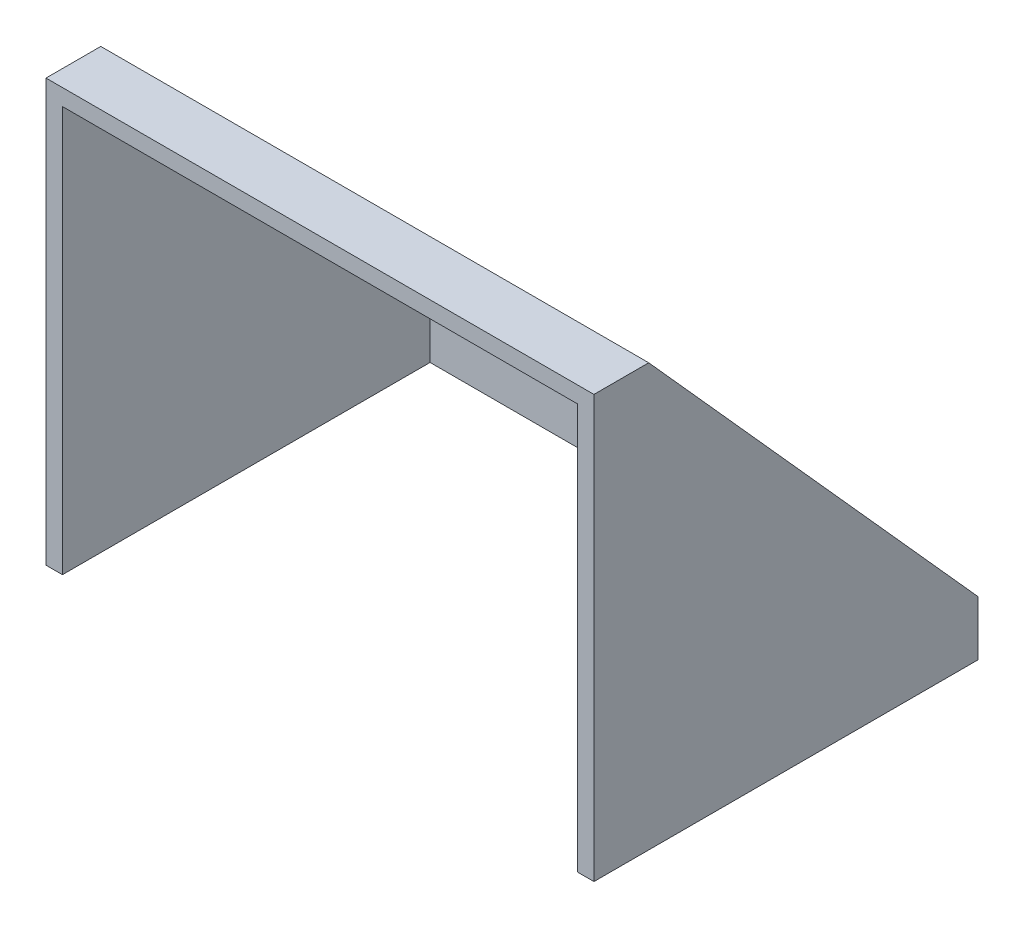
ISO-10303-21;
HEADER;
FILE_DESCRIPTION(('STEP AP214'),'2;1');
FILE_NAME('part.step','',(''),(''),'','','');
FILE_SCHEMA(('AUTOMOTIVE_DESIGN { 1 0 10303 214 1 1 1 1 }'));
ENDSEC;
DATA;
#1=APPLICATION_CONTEXT('core data for automotive mechanical design processes');
#2=APPLICATION_PROTOCOL_DEFINITION('international standard','automotive_design',2000,#1);
#3=PRODUCT_CONTEXT('',#1,'mechanical');
#4=PRODUCT('Part','Part','',(#3));
#5=PRODUCT_RELATED_PRODUCT_CATEGORY('part','',(#4));
#6=PRODUCT_DEFINITION_FORMATION('','',#4);
#7=PRODUCT_DEFINITION_CONTEXT('part definition',#1,'design');
#8=PRODUCT_DEFINITION('design','',#6,#7);
#9=PRODUCT_DEFINITION_SHAPE('','',#8);
#10=(LENGTH_UNIT() NAMED_UNIT(*) SI_UNIT(.MILLI.,.METRE.));
#11=(NAMED_UNIT(*) PLANE_ANGLE_UNIT() SI_UNIT($,.RADIAN.));
#12=(NAMED_UNIT(*) SI_UNIT($,.STERADIAN.) SOLID_ANGLE_UNIT());
#13=UNCERTAINTY_MEASURE_WITH_UNIT(LENGTH_MEASURE(1.E-05),#10,'distance_accuracy_value','');
#14=(GEOMETRIC_REPRESENTATION_CONTEXT(3) GLOBAL_UNCERTAINTY_ASSIGNED_CONTEXT((#13)) GLOBAL_UNIT_ASSIGNED_CONTEXT((#10,
#11,#12)) REPRESENTATION_CONTEXT('',''));
#15=CARTESIAN_POINT('',(0.,0.,0.));
#16=DIRECTION('',(0.,0.,1.));
#17=DIRECTION('',(1.,0.,0.));
#18=AXIS2_PLACEMENT_3D('',#15,#16,#17);
#19=CARTESIAN_POINT('',(50.,77.,0.));
#20=DIRECTION('',(0.,0.,-1.));
#21=DIRECTION('',(0.,1.,0.));
#22=AXIS2_PLACEMENT_3D('',#19,#20,#21);
#23=PLANE('',#22);
#24=DIRECTION('',(0.,-1.,0.));
#25=VECTOR('',#24,1.);
#26=CARTESIAN_POINT('',(-47.,77.,0.));
#27=LINE('',#26,#25);
#28=CARTESIAN_POINT('',(-47.,74.,0.));
#29=VERTEX_POINT('',#28);
#30=CARTESIAN_POINT('',(-47.,0.,0.));
#31=VERTEX_POINT('',#30);
#32=EDGE_CURVE('E170',#29,#31,#27,.T.);
#33=ORIENTED_EDGE('',*,*,#32,.F.);
#34=DIRECTION('',(-1.,0.,0.));
#35=VECTOR('',#34,1.);
#36=CARTESIAN_POINT('',(50.,74.,0.));
#37=LINE('',#36,#35);
#38=CARTESIAN_POINT('',(47.,74.,0.));
#39=VERTEX_POINT('',#38);
#40=EDGE_CURVE('E188',#39,#29,#37,.T.);
#41=ORIENTED_EDGE('',*,*,#40,.F.);
#42=DIRECTION('',(0.,-1.,0.));
#43=VECTOR('',#42,1.);
#44=CARTESIAN_POINT('',(47.,77.,0.));
#45=LINE('',#44,#43);
#46=CARTESIAN_POINT('',(47.,0.,0.));
#47=VERTEX_POINT('',#46);
#48=EDGE_CURVE('E192',#39,#47,#45,.T.);
#49=ORIENTED_EDGE('',*,*,#48,.T.);
#50=DIRECTION('',(-1.,0.,0.));
#51=VECTOR('',#50,1.);
#52=CARTESIAN_POINT('',(50.,0.,0.));
#53=LINE('',#52,#51);
#54=CARTESIAN_POINT('',(50.,0.,0.));
#55=VERTEX_POINT('',#54);
#56=EDGE_CURVE('E11',#55,#47,#53,.T.);
#57=ORIENTED_EDGE('',*,*,#56,.F.);
#58=DIRECTION('',(0.,-1.,0.));
#59=VECTOR('',#58,1.);
#60=CARTESIAN_POINT('',(50.,77.,0.));
#61=LINE('',#60,#59);
#62=CARTESIAN_POINT('',(50.,77.,0.));
#63=VERTEX_POINT('',#62);
#64=EDGE_CURVE('E205',#63,#55,#61,.T.);
#65=ORIENTED_EDGE('',*,*,#64,.F.);
#66=DIRECTION('',(-1.,0.,0.));
#67=VECTOR('',#66,1.);
#68=CARTESIAN_POINT('',(50.,77.,0.));
#69=LINE('',#68,#67);
#70=CARTESIAN_POINT('',(-50.,77.,0.));
#71=VERTEX_POINT('',#70);
#72=EDGE_CURVE('E217',#63,#71,#69,.T.);
#73=ORIENTED_EDGE('',*,*,#72,.T.);
#74=DIRECTION('',(0.,-1.,0.));
#75=VECTOR('',#74,1.);
#76=CARTESIAN_POINT('',(-50.,77.,0.));
#77=LINE('',#76,#75);
#78=CARTESIAN_POINT('',(-50.,0.,0.));
#79=VERTEX_POINT('',#78);
#80=EDGE_CURVE('E196',#71,#79,#77,.T.);
#81=ORIENTED_EDGE('',*,*,#80,.T.);
#82=EDGE_CURVE('E40',#31,#79,#53,.T.);
#83=ORIENTED_EDGE('',*,*,#82,.F.);
#84=EDGE_LOOP('',(#33,#41,#49,#57,#65,#73,#81,#83));
#85=FACE_BOUND('',#84,.T.);
#86=ADVANCED_FACE('F33',(#85),#23,.F.);
#87=CARTESIAN_POINT('',(50.,0.,0.));
#88=DIRECTION('',(0.,1.,0.));
#89=DIRECTION('',(0.,0.,1.));
#90=AXIS2_PLACEMENT_3D('',#87,#88,#89);
#91=PLANE('',#90);
#92=DIRECTION('',(0.,0.,-1.));
#93=VECTOR('',#92,1.);
#94=CARTESIAN_POINT('',(-47.,0.,0.));
#95=LINE('',#94,#93);
#96=CARTESIAN_POINT('',(-47.,0.,-67.0915967502945));
#97=VERTEX_POINT('',#96);
#98=EDGE_CURVE('E174',#31,#97,#95,.T.);
#99=ORIENTED_EDGE('',*,*,#98,.F.);
#100=ORIENTED_EDGE('',*,*,#82,.T.);
#101=DIRECTION('',(0.,0.,-1.));
#102=VECTOR('',#101,1.);
#103=CARTESIAN_POINT('',(-50.,0.,0.));
#104=LINE('',#103,#102);
#105=CARTESIAN_POINT('',(-50.,0.,-70.0915967502945));
#106=VERTEX_POINT('',#105);
#107=EDGE_CURVE('E220',#79,#106,#104,.T.);
#108=ORIENTED_EDGE('',*,*,#107,.T.);
#109=DIRECTION('',(-1.,0.,0.));
#110=VECTOR('',#109,1.);
#111=CARTESIAN_POINT('',(50.,0.,-70.0915967502945));
#112=LINE('',#111,#110);
#113=CARTESIAN_POINT('',(50.,0.,-70.0915967502945));
#114=VERTEX_POINT('',#113);
#115=EDGE_CURVE('E234',#114,#106,#112,.T.);
#116=ORIENTED_EDGE('',*,*,#115,.F.);
#117=DIRECTION('',(0.,0.,-1.));
#118=VECTOR('',#117,1.);
#119=CARTESIAN_POINT('',(50.,0.,0.));
#120=LINE('',#119,#118);
#121=EDGE_CURVE('E208',#55,#114,#120,.T.);
#122=ORIENTED_EDGE('',*,*,#121,.F.);
#123=ORIENTED_EDGE('',*,*,#56,.T.);
#124=DIRECTION('',(0.,0.,-1.));
#125=VECTOR('',#124,1.);
#126=CARTESIAN_POINT('',(47.,0.,0.));
#127=LINE('',#126,#125);
#128=CARTESIAN_POINT('',(47.,0.,-67.0915967502945));
#129=VERTEX_POINT('',#128);
#130=EDGE_CURVE('E183',#47,#129,#127,.T.);
#131=ORIENTED_EDGE('',*,*,#130,.T.);
#132=DIRECTION('',(-1.,0.,0.));
#133=VECTOR('',#132,1.);
#134=CARTESIAN_POINT('',(50.,0.,-67.0915967502945));
#135=LINE('',#134,#133);
#136=EDGE_CURVE('E178',#129,#97,#135,.T.);
#137=ORIENTED_EDGE('',*,*,#136,.T.);
#138=EDGE_LOOP('',(#99,#100,#108,#116,#122,#123,#131,#137));
#139=FACE_BOUND('',#138,.T.);
#140=ADVANCED_FACE('F244',(#139),#91,.F.);
#141=CARTESIAN_POINT('',(50.,0.,-70.0915967502945));
#142=DIRECTION('',(0.,0.,1.));
#143=DIRECTION('',(0.,-1.,0.));
#144=AXIS2_PLACEMENT_3D('',#141,#142,#143);
#145=PLANE('',#144);
#146=DIRECTION('',(0.,1.,0.));
#147=VECTOR('',#146,1.);
#148=CARTESIAN_POINT('',(-50.,0.,-70.0915967502945));
#149=LINE('',#148,#147);
#150=CARTESIAN_POINT('',(-50.,9.99999999999998,-70.0915967502944));
#151=VERTEX_POINT('',#150);
#152=EDGE_CURVE('E222',#106,#151,#149,.T.);
#153=ORIENTED_EDGE('',*,*,#152,.T.);
#154=DIRECTION('',(-1.,0.,0.));
#155=VECTOR('',#154,1.);
#156=CARTESIAN_POINT('',(50.,9.99999999999998,-70.0915967502944));
#157=LINE('',#156,#155);
#158=CARTESIAN_POINT('',(50.,9.99999999999998,-70.0915967502944));
#159=VERTEX_POINT('',#158);
#160=EDGE_CURVE('E232',#159,#151,#157,.T.);
#161=ORIENTED_EDGE('',*,*,#160,.F.);
#162=DIRECTION('',(0.,1.,0.));
#163=VECTOR('',#162,1.);
#164=CARTESIAN_POINT('',(50.,0.,-70.0915967502945));
#165=LINE('',#164,#163);
#166=EDGE_CURVE('E211',#114,#159,#165,.T.);
#167=ORIENTED_EDGE('',*,*,#166,.F.);
#168=ORIENTED_EDGE('',*,*,#115,.T.);
#169=EDGE_LOOP('',(#153,#161,#167,#168));
#170=FACE_BOUND('',#169,.T.);
#171=ADVANCED_FACE('F263',(#170),#145,.F.);
#172=CARTESIAN_POINT('',(50.,9.99999999999998,-70.0915967502944));
#173=DIRECTION('',(0.,-0.667684408336605,0.744444444444444));
#174=DIRECTION('',(0.,-0.744444444444445,-0.667684408336605));
#175=AXIS2_PLACEMENT_3D('',#172,#173,#174);
#176=PLANE('',#175);
#177=CARTESIAN_POINT('',(-3.79999999999999,16.1788888888889,-64.5498161611006));
#178=DIRECTION('',(0.,0.667684408336605,-0.744444444444444));
#179=DIRECTION('',(0.,0.744444444444444,0.667684408336605));
#180=AXIS2_PLACEMENT_3D('',#177,#178,#179);
#181=CIRCLE('',#180,2.5);
#182=CARTESIAN_POINT('',(-3.79999999999999,18.04,-62.8806051402591));
#183=VERTEX_POINT('',#182);
#184=EDGE_CURVE('E489',#183,#183,#181,.T.);
#185=ORIENTED_EDGE('',*,*,#184,.F.);
#186=EDGE_LOOP('',(#185));
#187=FACE_BOUND('',#186,.T.);
#188=CARTESIAN_POINT('',(36.75,18.4122222222222,-62.5467629360908));
#189=DIRECTION('',(0.,0.667684408336605,-0.744444444444444));
#190=DIRECTION('',(0.,0.744444444444444,0.667684408336605));
#191=AXIS2_PLACEMENT_3D('',#188,#189,#190);
#192=CIRCLE('',#191,3.);
#193=CARTESIAN_POINT('',(36.75,20.6455555555556,-60.543709711081));
#194=VERTEX_POINT('',#193);
#195=EDGE_CURVE('E492',#194,#194,#192,.T.);
#196=ORIENTED_EDGE('',*,*,#195,.F.);
#197=EDGE_LOOP('',(#196));
#198=FACE_BOUND('',#197,.T.);
#199=CARTESIAN_POINT('',(-37.5,16.4766666666667,-64.282742397766));
#200=DIRECTION('',(0.,0.667684408336605,-0.744444444444444));
#201=DIRECTION('',(0.,0.744444444444444,0.667684408336605));
#202=AXIS2_PLACEMENT_3D('',#199,#200,#201);
#203=CIRCLE('',#202,5.);
#204=CARTESIAN_POINT('',(-37.5,20.1988888888889,-60.944320356083));
#205=VERTEX_POINT('',#204);
#206=EDGE_CURVE('E540',#205,#205,#203,.T.);
#207=ORIENTED_EDGE('',*,*,#206,.F.);
#208=EDGE_LOOP('',(#207));
#209=FACE_BOUND('',#208,.T.);
#210=CARTESIAN_POINT('',(-44.,24.5166666666667,-57.0717507877307));
#211=DIRECTION('',(0.,0.667684408336605,-0.744444444444444));
#212=DIRECTION('',(0.,0.744444444444444,0.667684408336605));
#213=AXIS2_PLACEMENT_3D('',#210,#211,#212);
#214=CIRCLE('',#213,1.6);
#215=CARTESIAN_POINT('',(-44.,25.7077777777778,-56.0034557343921));
#216=VERTEX_POINT('',#215);
#217=EDGE_CURVE('E532',#216,#216,#214,.T.);
#218=ORIENTED_EDGE('',*,*,#217,.F.);
#219=EDGE_LOOP('',(#218));
#220=FACE_BOUND('',#219,.T.);
#221=CARTESIAN_POINT('',(44.,24.5166666666667,-57.0717507877307));
#222=DIRECTION('',(0.,0.667684408336605,-0.744444444444444));
#223=DIRECTION('',(0.,0.744444444444444,0.667684408336605));
#224=AXIS2_PLACEMENT_3D('',#221,#222,#223);
#225=CIRCLE('',#224,1.6);
#226=CARTESIAN_POINT('',(44.,25.7077777777778,-56.0034557343921));
#227=VERTEX_POINT('',#226);
#228=EDGE_CURVE('E513',#227,#227,#225,.T.);
#229=ORIENTED_EDGE('',*,*,#228,.F.);
#230=EDGE_LOOP('',(#229));
#231=FACE_BOUND('',#230,.T.);
#232=CARTESIAN_POINT('',(44.,72.9055555555556,-13.6722642458513));
#233=DIRECTION('',(0.,0.667684408336605,-0.744444444444444));
#234=DIRECTION('',(0.,0.744444444444444,0.667684408336605));
#235=AXIS2_PLACEMENT_3D('',#232,#233,#234);
#236=CIRCLE('',#235,1.6);
#237=CARTESIAN_POINT('',(44.,74.0966666666667,-12.6039691925128));
#238=VERTEX_POINT('',#237);
#239=EDGE_CURVE('E507',#238,#238,#236,.T.);
#240=ORIENTED_EDGE('',*,*,#239,.F.);
#241=EDGE_LOOP('',(#240));
#242=FACE_BOUND('',#241,.T.);
#243=CARTESIAN_POINT('',(-44.,72.9055555555556,-13.6722642458513));
#244=DIRECTION('',(0.,0.667684408336605,-0.744444444444444));
#245=DIRECTION('',(0.,0.744444444444444,0.667684408336605));
#246=AXIS2_PLACEMENT_3D('',#243,#244,#245);
#247=CIRCLE('',#246,1.6);
#248=CARTESIAN_POINT('',(-44.,74.0966666666667,-12.6039691925127));
#249=VERTEX_POINT('',#248);
#250=EDGE_CURVE('E500',#249,#249,#247,.T.);
#251=ORIENTED_EDGE('',*,*,#250,.F.);
#252=EDGE_LOOP('',(#251));
#253=FACE_BOUND('',#252,.T.);
#254=DIRECTION('',(0.,-0.744444444444444,-0.667684408336605));
#255=VECTOR('',#254,1.);
#256=CARTESIAN_POINT('',(39.5,68.0666666666667,-18.0122129000393));
#257=LINE('',#256,#255);
#258=CARTESIAN_POINT('',(39.5,68.0666666666667,-18.0122129000393));
#259=VERTEX_POINT('',#258);
#260=CARTESIAN_POINT('',(39.5,29.6533333333333,-52.4647283702081));
#261=VERTEX_POINT('',#260);
#262=EDGE_CURVE('E157',#259,#261,#257,.T.);
#263=ORIENTED_EDGE('',*,*,#262,.F.);
#264=DIRECTION('',(1.,0.,0.));
#265=VECTOR('',#264,1.);
#266=CARTESIAN_POINT('',(39.5,68.0666666666667,-18.0122129000393));
#267=LINE('',#266,#265);
#268=CARTESIAN_POINT('',(-39.5,68.0666666666667,-18.0122129000392));
#269=VERTEX_POINT('',#268);
#270=EDGE_CURVE('E150',#269,#259,#267,.T.);
#271=ORIENTED_EDGE('',*,*,#270,.F.);
#272=DIRECTION('',(0.,0.744444444444445,0.667684408336605));
#273=VECTOR('',#272,1.);
#274=CARTESIAN_POINT('',(-39.5,68.0666666666667,-18.0122129000392));
#275=LINE('',#274,#273);
#276=CARTESIAN_POINT('',(-39.5,29.6533333333333,-52.4647283702081));
#277=VERTEX_POINT('',#276);
#278=EDGE_CURVE('E161',#277,#269,#275,.T.);
#279=ORIENTED_EDGE('',*,*,#278,.F.);
#280=DIRECTION('',(-1.,0.,0.));
#281=VECTOR('',#280,1.);
#282=CARTESIAN_POINT('',(39.5,29.6533333333333,-52.4647283702081));
#283=LINE('',#282,#281);
#284=EDGE_CURVE('E47',#261,#277,#283,.T.);
#285=ORIENTED_EDGE('',*,*,#284,.F.);
#286=EDGE_LOOP('',(#263,#271,#279,#285));
#287=FACE_BOUND('',#286,.T.);
#288=DIRECTION('',(0.,0.744444444444444,0.667684408336605));
#289=VECTOR('',#288,1.);
#290=CARTESIAN_POINT('',(-50.,9.99999999999998,-70.0915967502944));
#291=LINE('',#290,#289);
#292=CARTESIAN_POINT('',(-50.,77.,-9.99999999999999));
#293=VERTEX_POINT('',#292);
#294=EDGE_CURVE('E224',#151,#293,#291,.T.);
#295=ORIENTED_EDGE('',*,*,#294,.T.);
#296=DIRECTION('',(-1.,0.,0.));
#297=VECTOR('',#296,1.);
#298=CARTESIAN_POINT('',(50.,77.,-9.99999999999999));
#299=LINE('',#298,#297);
#300=CARTESIAN_POINT('',(50.,77.,-9.99999999999999));
#301=VERTEX_POINT('',#300);
#302=EDGE_CURVE('E229',#301,#293,#299,.T.);
#303=ORIENTED_EDGE('',*,*,#302,.F.);
#304=DIRECTION('',(0.,0.744444444444444,0.667684408336605));
#305=VECTOR('',#304,1.);
#306=CARTESIAN_POINT('',(50.,9.99999999999998,-70.0915967502944));
#307=LINE('',#306,#305);
#308=EDGE_CURVE('E213',#159,#301,#307,.T.);
#309=ORIENTED_EDGE('',*,*,#308,.F.);
#310=ORIENTED_EDGE('',*,*,#160,.T.);
#311=EDGE_LOOP('',(#295,#303,#309,#310));
#312=FACE_BOUND('',#311,.T.);
#313=ADVANCED_FACE('F260',(#187,#198,#209,#220,#231,#242,#253,#287,#312),#176,.F.);
#314=CARTESIAN_POINT('',(50.,77.,-9.99999999999999));
#315=DIRECTION('',(0.,-1.,0.));
#316=DIRECTION('',(0.,0.,-1.));
#317=AXIS2_PLACEMENT_3D('',#314,#315,#316);
#318=PLANE('',#317);
#319=DIRECTION('',(0.,0.,1.));
#320=VECTOR('',#319,1.);
#321=CARTESIAN_POINT('',(-50.,77.,-9.99999999999999));
#322=LINE('',#321,#320);
#323=EDGE_CURVE('E209',#293,#71,#322,.T.);
#324=ORIENTED_EDGE('',*,*,#323,.T.);
#325=ORIENTED_EDGE('',*,*,#72,.F.);
#326=DIRECTION('',(0.,0.,1.));
#327=VECTOR('',#326,1.);
#328=CARTESIAN_POINT('',(50.,77.,-9.99999999999999));
#329=LINE('',#328,#327);
#330=EDGE_CURVE('E215',#301,#63,#329,.T.);
#331=ORIENTED_EDGE('',*,*,#330,.F.);
#332=ORIENTED_EDGE('',*,*,#302,.T.);
#333=EDGE_LOOP('',(#324,#325,#331,#332));
#334=FACE_BOUND('',#333,.T.);
#335=ADVANCED_FACE('F257',(#334),#318,.F.);
#336=CARTESIAN_POINT('',(50.,0.,0.));
#337=DIRECTION('',(1.,0.,0.));
#338=DIRECTION('',(0.,0.,-1.));
#339=AXIS2_PLACEMENT_3D('',#336,#337,#338);
#340=PLANE('',#339);
#341=ORIENTED_EDGE('',*,*,#64,.T.);
#342=ORIENTED_EDGE('',*,*,#121,.T.);
#343=ORIENTED_EDGE('',*,*,#166,.T.);
#344=ORIENTED_EDGE('',*,*,#308,.T.);
#345=ORIENTED_EDGE('',*,*,#330,.T.);
#346=EDGE_LOOP('',(#341,#342,#343,#344,#345));
#347=FACE_BOUND('',#346,.T.);
#348=ADVANCED_FACE('F265',(#347),#340,.T.);
#349=CARTESIAN_POINT('',(-50.,0.,0.));
#350=DIRECTION('',(1.,0.,0.));
#351=DIRECTION('',(0.,0.,-1.));
#352=AXIS2_PLACEMENT_3D('',#349,#350,#351);
#353=PLANE('',#352);
#354=ORIENTED_EDGE('',*,*,#80,.F.);
#355=ORIENTED_EDGE('',*,*,#323,.F.);
#356=ORIENTED_EDGE('',*,*,#294,.F.);
#357=ORIENTED_EDGE('',*,*,#152,.F.);
#358=ORIENTED_EDGE('',*,*,#107,.F.);
#359=EDGE_LOOP('',(#354,#355,#356,#357,#358));
#360=FACE_BOUND('',#359,.T.);
#361=ADVANCED_FACE('F249',(#360),#353,.F.);
#362=CARTESIAN_POINT('',(50.,0.,-67.0915967502945));
#363=DIRECTION('',(0.,0.,1.));
#364=DIRECTION('',(0.,-1.,0.));
#365=AXIS2_PLACEMENT_3D('',#362,#363,#364);
#366=PLANE('',#365);
#367=DIRECTION('',(0.,1.,0.));
#368=VECTOR('',#367,1.);
#369=CARTESIAN_POINT('',(-47.,0.,-67.0915967502945));
#370=LINE('',#369,#368);
#371=CARTESIAN_POINT('',(-47.,8.8517529283383,-67.0915967502944));
#372=VERTEX_POINT('',#371);
#373=EDGE_CURVE('E171',#97,#372,#370,.T.);
#374=ORIENTED_EDGE('',*,*,#373,.F.);
#375=ORIENTED_EDGE('',*,*,#136,.F.);
#376=DIRECTION('',(0.,1.,0.));
#377=VECTOR('',#376,1.);
#378=CARTESIAN_POINT('',(47.,0.,-67.0915967502945));
#379=LINE('',#378,#377);
#380=CARTESIAN_POINT('',(47.,8.8517529283383,-67.0915967502944));
#381=VERTEX_POINT('',#380);
#382=EDGE_CURVE('E180',#129,#381,#379,.T.);
#383=ORIENTED_EDGE('',*,*,#382,.T.);
#384=DIRECTION('',(-1.,0.,0.));
#385=VECTOR('',#384,1.);
#386=CARTESIAN_POINT('',(50.,8.8517529283383,-67.0915967502944));
#387=LINE('',#386,#385);
#388=EDGE_CURVE('E175',#381,#372,#387,.T.);
#389=ORIENTED_EDGE('',*,*,#388,.T.);
#390=EDGE_LOOP('',(#374,#375,#383,#389));
#391=FACE_BOUND('',#390,.T.);
#392=ADVANCED_FACE('F276',(#391),#366,.T.);
#393=CARTESIAN_POINT('',(50.,7.99694677499017,-67.8582634169611));
#394=DIRECTION('',(0.,-0.667684408336605,0.744444444444444));
#395=DIRECTION('',(0.,-0.744444444444445,-0.667684408336605));
#396=AXIS2_PLACEMENT_3D('',#393,#394,#395);
#397=PLANE('',#396);
#398=CARTESIAN_POINT('',(-3.79999999999999,14.1758356638791,-62.3164828277673));
#399=DIRECTION('',(0.,-0.667684408336605,0.744444444444444));
#400=DIRECTION('',(0.,-0.744444444444445,-0.667684408336605));
#401=AXIS2_PLACEMENT_3D('',#398,#399,#400);
#402=CIRCLE('',#401,2.5);
#403=CARTESIAN_POINT('',(-3.79999999999999,12.3147245527679,-63.9856938486088));
#404=VERTEX_POINT('',#403);
#405=EDGE_CURVE('E491',#404,#404,#402,.F.);
#406=ORIENTED_EDGE('',*,*,#405,.T.);
#407=EDGE_LOOP('',(#406));
#408=FACE_BOUND('',#407,.T.);
#409=CARTESIAN_POINT('',(36.75,16.4091689972124,-60.3134296027575));
#410=DIRECTION('',(0.,-0.667684408336605,0.744444444444444));
#411=DIRECTION('',(0.,-0.744444444444445,-0.667684408336605));
#412=AXIS2_PLACEMENT_3D('',#409,#410,#411);
#413=CIRCLE('',#412,3.);
#414=CARTESIAN_POINT('',(36.75,14.1758356638791,-62.3164828277673));
#415=VERTEX_POINT('',#414);
#416=EDGE_CURVE('E495',#415,#415,#413,.F.);
#417=ORIENTED_EDGE('',*,*,#416,.T.);
#418=EDGE_LOOP('',(#417));
#419=FACE_BOUND('',#418,.T.);
#420=CARTESIAN_POINT('',(-37.5,14.4736134416569,-62.0494090644326));
#421=DIRECTION('',(0.,-0.667684408336605,0.744444444444444));
#422=DIRECTION('',(0.,-0.744444444444445,-0.667684408336605));
#423=AXIS2_PLACEMENT_3D('',#420,#421,#422);
#424=CIRCLE('',#423,5.);
#425=CARTESIAN_POINT('',(-37.5,10.7513912194346,-65.3878311061157));
#426=VERTEX_POINT('',#425);
#427=EDGE_CURVE('E537',#426,#426,#424,.F.);
#428=ORIENTED_EDGE('',*,*,#427,.T.);
#429=EDGE_LOOP('',(#428));
#430=FACE_BOUND('',#429,.T.);
#431=CARTESIAN_POINT('',(-44.,22.5136134416568,-54.8384174543973));
#432=DIRECTION('',(0.,-0.667684408336605,0.744444444444444));
#433=DIRECTION('',(0.,-0.744444444444445,-0.667684408336605));
#434=AXIS2_PLACEMENT_3D('',#431,#432,#433);
#435=CIRCLE('',#434,1.6);
#436=CARTESIAN_POINT('',(-44.,21.3225023305457,-55.9067125077359));
#437=VERTEX_POINT('',#436);
#438=EDGE_CURVE('E516',#437,#437,#435,.F.);
#439=ORIENTED_EDGE('',*,*,#438,.T.);
#440=EDGE_LOOP('',(#439));
#441=FACE_BOUND('',#440,.T.);
#442=CARTESIAN_POINT('',(44.,22.5136134416568,-54.8384174543973));
#443=DIRECTION('',(0.,-0.667684408336605,0.744444444444444));
#444=DIRECTION('',(0.,-0.744444444444445,-0.667684408336605));
#445=AXIS2_PLACEMENT_3D('',#442,#443,#444);
#446=CIRCLE('',#445,1.6);
#447=CARTESIAN_POINT('',(44.,21.3225023305457,-55.9067125077359));
#448=VERTEX_POINT('',#447);
#449=EDGE_CURVE('E510',#448,#448,#446,.F.);
#450=ORIENTED_EDGE('',*,*,#449,.T.);
#451=EDGE_LOOP('',(#450));
#452=FACE_BOUND('',#451,.T.);
#453=CARTESIAN_POINT('',(44.,70.9025023305457,-11.438930912518));
#454=DIRECTION('',(0.,-0.667684408336605,0.744444444444444));
#455=DIRECTION('',(0.,-0.744444444444445,-0.667684408336605));
#456=AXIS2_PLACEMENT_3D('',#453,#454,#455);
#457=CIRCLE('',#456,1.6);
#458=CARTESIAN_POINT('',(44.,69.7113912194346,-12.5072259658565));
#459=VERTEX_POINT('',#458);
#460=EDGE_CURVE('E504',#459,#459,#457,.F.);
#461=ORIENTED_EDGE('',*,*,#460,.T.);
#462=EDGE_LOOP('',(#461));
#463=FACE_BOUND('',#462,.T.);
#464=CARTESIAN_POINT('',(-44.,70.9025023305458,-11.438930912518));
#465=DIRECTION('',(0.,-0.667684408336605,0.744444444444444));
#466=DIRECTION('',(0.,-0.744444444444445,-0.667684408336605));
#467=AXIS2_PLACEMENT_3D('',#464,#465,#466);
#468=CIRCLE('',#467,1.6);
#469=CARTESIAN_POINT('',(-44.,69.7113912194346,-12.5072259658565));
#470=VERTEX_POINT('',#469);
#471=EDGE_CURVE('E503',#470,#470,#468,.F.);
#472=ORIENTED_EDGE('',*,*,#471,.T.);
#473=EDGE_LOOP('',(#472));
#474=FACE_BOUND('',#473,.T.);
#475=DIRECTION('',(1.,0.,0.));
#476=VECTOR('',#475,1.);
#477=CARTESIAN_POINT('',(39.5,66.0636134416568,-15.7788795667059));
#478=LINE('',#477,#476);
#479=CARTESIAN_POINT('',(-39.5,66.0636134416569,-15.7788795667059));
#480=VERTEX_POINT('',#479);
#481=CARTESIAN_POINT('',(39.5,66.0636134416568,-15.7788795667059));
#482=VERTEX_POINT('',#481);
#483=EDGE_CURVE('E147',#480,#482,#478,.T.);
#484=ORIENTED_EDGE('',*,*,#483,.T.);
#485=DIRECTION('',(0.,-0.744444444444445,-0.667684408336605));
#486=VECTOR('',#485,1.);
#487=CARTESIAN_POINT('',(39.5,66.0636134416568,-15.7788795667059));
#488=LINE('',#487,#486);
#489=CARTESIAN_POINT('',(39.5,27.6502801083235,-50.2313950368747));
#490=VERTEX_POINT('',#489);
#491=EDGE_CURVE('E134',#482,#490,#488,.T.);
#492=ORIENTED_EDGE('',*,*,#491,.T.);
#493=DIRECTION('',(-1.,0.,0.));
#494=VECTOR('',#493,1.);
#495=CARTESIAN_POINT('',(39.5,27.6502801083235,-50.2313950368747));
#496=LINE('',#495,#494);
#497=CARTESIAN_POINT('',(-39.5,27.6502801083235,-50.2313950368747));
#498=VERTEX_POINT('',#497);
#499=EDGE_CURVE('E165',#490,#498,#496,.T.);
#500=ORIENTED_EDGE('',*,*,#499,.T.);
#501=DIRECTION('',(0.,0.744444444444445,0.667684408336605));
#502=VECTOR('',#501,1.);
#503=CARTESIAN_POINT('',(-39.5,66.0636134416569,-15.7788795667059));
#504=LINE('',#503,#502);
#505=EDGE_CURVE('E155',#498,#480,#504,.T.);
#506=ORIENTED_EDGE('',*,*,#505,.T.);
#507=EDGE_LOOP('',(#484,#492,#500,#506));
#508=FACE_BOUND('',#507,.T.);
#509=DIRECTION('',(0.,0.744444444444445,0.667684408336605));
#510=VECTOR('',#509,1.);
#511=CARTESIAN_POINT('',(-47.,7.99694677499017,-67.8582634169611));
#512=LINE('',#511,#510);
#513=CARTESIAN_POINT('',(-47.,74.,-8.66081776493853));
#514=VERTEX_POINT('',#513);
#515=EDGE_CURVE('E173',#372,#514,#512,.T.);
#516=ORIENTED_EDGE('',*,*,#515,.F.);
#517=ORIENTED_EDGE('',*,*,#388,.F.);
#518=DIRECTION('',(0.,0.744444444444445,0.667684408336605));
#519=VECTOR('',#518,1.);
#520=CARTESIAN_POINT('',(47.,7.99694677499017,-67.8582634169611));
#521=LINE('',#520,#519);
#522=CARTESIAN_POINT('',(47.,74.,-8.66081776493853));
#523=VERTEX_POINT('',#522);
#524=EDGE_CURVE('E182',#381,#523,#521,.T.);
#525=ORIENTED_EDGE('',*,*,#524,.T.);
#526=DIRECTION('',(-1.,0.,0.));
#527=VECTOR('',#526,1.);
#528=CARTESIAN_POINT('',(50.,74.,-8.66081776493853));
#529=LINE('',#528,#527);
#530=EDGE_CURVE('E179',#523,#514,#529,.T.);
#531=ORIENTED_EDGE('',*,*,#530,.T.);
#532=EDGE_LOOP('',(#516,#517,#525,#531));
#533=FACE_BOUND('',#532,.T.);
#534=ADVANCED_FACE('F153',(#408,#419,#430,#441,#452,#463,#474,#508,#533),#397,.T.);
#535=CARTESIAN_POINT('',(50.,74.,-9.99999999999999));
#536=DIRECTION('',(0.,-1.,0.));
#537=DIRECTION('',(0.,0.,-1.));
#538=AXIS2_PLACEMENT_3D('',#535,#536,#537);
#539=PLANE('',#538);
#540=DIRECTION('',(0.,0.,1.));
#541=VECTOR('',#540,1.);
#542=CARTESIAN_POINT('',(-47.,74.,-9.99999999999999));
#543=LINE('',#542,#541);
#544=EDGE_CURVE('E185',#514,#29,#543,.T.);
#545=ORIENTED_EDGE('',*,*,#544,.F.);
#546=ORIENTED_EDGE('',*,*,#530,.F.);
#547=DIRECTION('',(0.,0.,1.));
#548=VECTOR('',#547,1.);
#549=CARTESIAN_POINT('',(47.,74.,-9.99999999999999));
#550=LINE('',#549,#548);
#551=EDGE_CURVE('E190',#523,#39,#550,.T.);
#552=ORIENTED_EDGE('',*,*,#551,.T.);
#553=ORIENTED_EDGE('',*,*,#40,.T.);
#554=EDGE_LOOP('',(#545,#546,#552,#553));
#555=FACE_BOUND('',#554,.T.);
#556=ADVANCED_FACE('F283',(#555),#539,.T.);
#557=CARTESIAN_POINT('',(47.,0.,0.));
#558=DIRECTION('',(1.,0.,0.));
#559=DIRECTION('',(0.,0.,-1.));
#560=AXIS2_PLACEMENT_3D('',#557,#558,#559);
#561=PLANE('',#560);
#562=ORIENTED_EDGE('',*,*,#48,.F.);
#563=ORIENTED_EDGE('',*,*,#551,.F.);
#564=ORIENTED_EDGE('',*,*,#524,.F.);
#565=ORIENTED_EDGE('',*,*,#382,.F.);
#566=ORIENTED_EDGE('',*,*,#130,.F.);
#567=EDGE_LOOP('',(#562,#563,#564,#565,#566));
#568=FACE_BOUND('',#567,.T.);
#569=ADVANCED_FACE('F270',(#568),#561,.F.);
#570=CARTESIAN_POINT('',(-47.,0.,0.));
#571=DIRECTION('',(1.,0.,0.));
#572=DIRECTION('',(0.,0.,-1.));
#573=AXIS2_PLACEMENT_3D('',#570,#571,#572);
#574=PLANE('',#573);
#575=ORIENTED_EDGE('',*,*,#32,.T.);
#576=ORIENTED_EDGE('',*,*,#98,.T.);
#577=ORIENTED_EDGE('',*,*,#373,.T.);
#578=ORIENTED_EDGE('',*,*,#515,.T.);
#579=ORIENTED_EDGE('',*,*,#544,.T.);
#580=EDGE_LOOP('',(#575,#576,#577,#578,#579));
#581=FACE_BOUND('',#580,.T.);
#582=ADVANCED_FACE('F279',(#581),#574,.T.);
#583=CARTESIAN_POINT('',(39.5,3.06179575280945,54.465913606178));
#584=DIRECTION('',(0.,0.744444444444444,0.667684408336605));
#585=DIRECTION('',(0.,-0.667684408336605,0.744444444444444));
#586=AXIS2_PLACEMENT_3D('',#583,#584,#585);
#587=PLANE('',#586);
#588=DIRECTION('',(0.,0.667684408336605,-0.744444444444444));
#589=VECTOR('',#588,1.);
#590=CARTESIAN_POINT('',(-39.5,3.06179575280946,54.465913606178));
#591=LINE('',#590,#589);
#592=EDGE_CURVE('E55',#480,#269,#591,.T.);
#593=ORIENTED_EDGE('',*,*,#592,.T.);
#594=ORIENTED_EDGE('',*,*,#270,.T.);
#595=DIRECTION('',(0.,0.667684408336605,-0.744444444444444));
#596=VECTOR('',#595,1.);
#597=CARTESIAN_POINT('',(39.5,3.06179575280945,54.465913606178));
#598=LINE('',#597,#596);
#599=EDGE_CURVE('E138',#482,#259,#598,.T.);
#600=ORIENTED_EDGE('',*,*,#599,.F.);
#601=ORIENTED_EDGE('',*,*,#483,.F.);
#602=EDGE_LOOP('',(#593,#594,#600,#601));
#603=FACE_BOUND('',#602,.T.);
#604=ADVANCED_FACE('F146',(#603),#587,.F.);
#605=CARTESIAN_POINT('',(39.5,3.06179575280945,54.465913606178));
#606=DIRECTION('',(1.,0.,0.));
#607=DIRECTION('',(0.,0.,-1.));
#608=AXIS2_PLACEMENT_3D('',#605,#606,#607);
#609=PLANE('',#608);
#610=ORIENTED_EDGE('',*,*,#599,.T.);
#611=ORIENTED_EDGE('',*,*,#262,.T.);
#612=DIRECTION('',(0.,0.667684408336605,-0.744444444444444));
#613=VECTOR('',#612,1.);
#614=CARTESIAN_POINT('',(39.5,-35.3515375805239,20.0133981360092));
#615=LINE('',#614,#613);
#616=EDGE_CURVE('E140',#490,#261,#615,.T.);
#617=ORIENTED_EDGE('',*,*,#616,.F.);
#618=ORIENTED_EDGE('',*,*,#491,.F.);
#619=EDGE_LOOP('',(#610,#611,#617,#618));
#620=FACE_BOUND('',#619,.T.);
#621=ADVANCED_FACE('F136',(#620),#609,.F.);
#622=CARTESIAN_POINT('',(39.5,-35.3515375805239,20.0133981360092));
#623=DIRECTION('',(0.,-0.744444444444444,-0.667684408336605));
#624=DIRECTION('',(0.,0.667684408336605,-0.744444444444444));
#625=AXIS2_PLACEMENT_3D('',#622,#623,#624);
#626=PLANE('',#625);
#627=ORIENTED_EDGE('',*,*,#616,.T.);
#628=ORIENTED_EDGE('',*,*,#284,.T.);
#629=DIRECTION('',(0.,0.667684408336605,-0.744444444444444));
#630=VECTOR('',#629,1.);
#631=CARTESIAN_POINT('',(-39.5,-35.3515375805239,20.0133981360092));
#632=LINE('',#631,#630);
#633=EDGE_CURVE('E164',#498,#277,#632,.T.);
#634=ORIENTED_EDGE('',*,*,#633,.F.);
#635=ORIENTED_EDGE('',*,*,#499,.F.);
#636=EDGE_LOOP('',(#627,#628,#634,#635));
#637=FACE_BOUND('',#636,.T.);
#638=ADVANCED_FACE('F337',(#637),#626,.F.);
#639=CARTESIAN_POINT('',(-39.5,3.06179575280946,54.465913606178));
#640=DIRECTION('',(-1.,0.,0.));
#641=DIRECTION('',(0.,0.,1.));
#642=AXIS2_PLACEMENT_3D('',#639,#640,#641);
#643=PLANE('',#642);
#644=ORIENTED_EDGE('',*,*,#633,.T.);
#645=ORIENTED_EDGE('',*,*,#278,.T.);
#646=ORIENTED_EDGE('',*,*,#592,.F.);
#647=ORIENTED_EDGE('',*,*,#505,.F.);
#648=EDGE_LOOP('',(#644,#645,#646,#647));
#649=FACE_BOUND('',#648,.T.);
#650=ADVANCED_FACE('F344',(#649),#643,.F.);
#651=CARTESIAN_POINT('',(-44.,7.90068464169835,58.8058622603659));
#652=DIRECTION('',(0.,0.667684408336605,-0.744444444444444));
#653=DIRECTION('',(0.,0.744444444444444,0.667684408336605));
#654=AXIS2_PLACEMENT_3D('',#651,#652,#653);
#655=CYLINDRICAL_SURFACE('',#654,1.6);
#656=ORIENTED_EDGE('',*,*,#250,.T.);
#657=EDGE_LOOP('',(#656));
#658=FACE_BOUND('',#657,.T.);
#659=ORIENTED_EDGE('',*,*,#471,.F.);
#660=EDGE_LOOP('',(#659));
#661=FACE_BOUND('',#660,.T.);
#662=ADVANCED_FACE('F351',(#658,#661),#655,.F.);
#663=CARTESIAN_POINT('',(44.,7.90068464169832,58.8058622603659));
#664=DIRECTION('',(0.,0.667684408336605,-0.744444444444444));
#665=DIRECTION('',(0.,0.744444444444444,0.667684408336605));
#666=AXIS2_PLACEMENT_3D('',#663,#664,#665);
#667=CYLINDRICAL_SURFACE('',#666,1.6);
#668=ORIENTED_EDGE('',*,*,#239,.T.);
#669=EDGE_LOOP('',(#668));
#670=FACE_BOUND('',#669,.T.);
#671=ORIENTED_EDGE('',*,*,#460,.F.);
#672=EDGE_LOOP('',(#671));
#673=FACE_BOUND('',#672,.T.);
#674=ADVANCED_FACE('F358',(#670,#673),#667,.F.);
#675=CARTESIAN_POINT('',(44.,-40.4882042471906,15.4063757184866));
#676=DIRECTION('',(0.,0.667684408336605,-0.744444444444444));
#677=DIRECTION('',(0.,0.744444444444444,0.667684408336605));
#678=AXIS2_PLACEMENT_3D('',#675,#676,#677);
#679=CYLINDRICAL_SURFACE('',#678,1.6);
#680=ORIENTED_EDGE('',*,*,#228,.T.);
#681=EDGE_LOOP('',(#680));
#682=FACE_BOUND('',#681,.T.);
#683=ORIENTED_EDGE('',*,*,#449,.F.);
#684=EDGE_LOOP('',(#683));
#685=FACE_BOUND('',#684,.T.);
#686=ADVANCED_FACE('F366',(#682,#685),#679,.F.);
#687=CARTESIAN_POINT('',(-44.,-40.4882042471906,15.4063757184866));
#688=DIRECTION('',(0.,0.667684408336605,-0.744444444444444));
#689=DIRECTION('',(0.,0.744444444444444,0.667684408336605));
#690=AXIS2_PLACEMENT_3D('',#687,#688,#689);
#691=CYLINDRICAL_SURFACE('',#690,1.6);
#692=ORIENTED_EDGE('',*,*,#217,.T.);
#693=EDGE_LOOP('',(#692));
#694=FACE_BOUND('',#693,.T.);
#695=ORIENTED_EDGE('',*,*,#438,.F.);
#696=EDGE_LOOP('',(#695));
#697=FACE_BOUND('',#696,.T.);
#698=ADVANCED_FACE('F374',(#694,#697),#691,.F.);
#699=CARTESIAN_POINT('',(-37.5,-48.5282042471905,8.19538410845126));
#700=DIRECTION('',(0.,0.667684408336605,-0.744444444444444));
#701=DIRECTION('',(0.,0.744444444444444,0.667684408336605));
#702=AXIS2_PLACEMENT_3D('',#699,#700,#701);
#703=CYLINDRICAL_SURFACE('',#702,5.);
#704=ORIENTED_EDGE('',*,*,#206,.T.);
#705=EDGE_LOOP('',(#704));
#706=FACE_BOUND('',#705,.T.);
#707=ORIENTED_EDGE('',*,*,#427,.F.);
#708=EDGE_LOOP('',(#707));
#709=FACE_BOUND('',#708,.T.);
#710=ADVANCED_FACE('F382',(#706,#709),#703,.F.);
#711=CARTESIAN_POINT('',(36.75,-46.592648691635,9.93136357012642));
#712=DIRECTION('',(0.,0.667684408336605,-0.744444444444444));
#713=DIRECTION('',(0.,0.744444444444444,0.667684408336605));
#714=AXIS2_PLACEMENT_3D('',#711,#712,#713);
#715=CYLINDRICAL_SURFACE('',#714,3.);
#716=ORIENTED_EDGE('',*,*,#195,.T.);
#717=EDGE_LOOP('',(#716));
#718=FACE_BOUND('',#717,.T.);
#719=ORIENTED_EDGE('',*,*,#416,.F.);
#720=EDGE_LOOP('',(#719));
#721=FACE_BOUND('',#720,.T.);
#722=ADVANCED_FACE('F390',(#718,#721),#715,.F.);
#723=CARTESIAN_POINT('',(-3.79999999999999,-48.8259820249683,7.92831034511661));
#724=DIRECTION('',(0.,0.667684408336605,-0.744444444444444));
#725=DIRECTION('',(0.,0.744444444444444,0.667684408336605));
#726=AXIS2_PLACEMENT_3D('',#723,#724,#725);
#727=CYLINDRICAL_SURFACE('',#726,2.5);
#728=ORIENTED_EDGE('',*,*,#184,.T.);
#729=EDGE_LOOP('',(#728));
#730=FACE_BOUND('',#729,.T.);
#731=ORIENTED_EDGE('',*,*,#405,.F.);
#732=EDGE_LOOP('',(#731));
#733=FACE_BOUND('',#732,.T.);
#734=ADVANCED_FACE('F398',(#730,#733),#727,.F.);
#735=CLOSED_SHELL('',(#86,#140,#171,#313,#335,#348,#361,#392,#534,#556,#569,#582,#604,#621,#638,
#650,#662,#674,#686,#698,#710,#722,#734));
#736=MANIFOLD_SOLID_BREP('B2',#735);
#737=ADVANCED_BREP_SHAPE_REPRESENTATION('',(#18,#736),#14);
#738=SHAPE_DEFINITION_REPRESENTATION(#9,#737);
ENDSEC;
END-ISO-10303-21;
